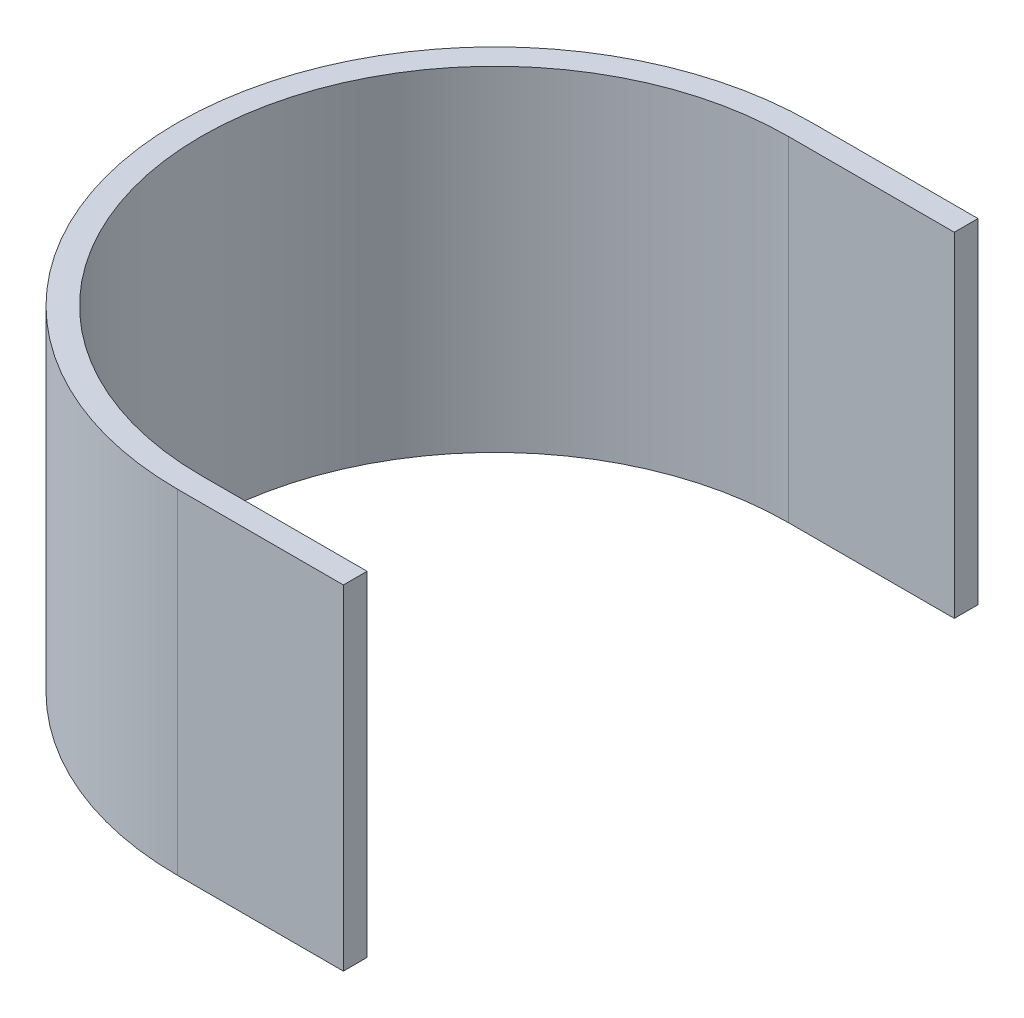
ISO-10303-21;
HEADER;
FILE_DESCRIPTION(('STEP AP214'),'2;1');
FILE_NAME('part.step','',(''),(''),'','','');
FILE_SCHEMA(('AUTOMOTIVE_DESIGN { 1 0 10303 214 1 1 1 1 }'));
ENDSEC;
DATA;
#1=APPLICATION_CONTEXT('core data for automotive mechanical design processes');
#2=APPLICATION_PROTOCOL_DEFINITION('international standard','automotive_design',2000,#1);
#3=PRODUCT_CONTEXT('',#1,'mechanical');
#4=PRODUCT('Part','Part','',(#3));
#5=PRODUCT_RELATED_PRODUCT_CATEGORY('part','',(#4));
#6=PRODUCT_DEFINITION_FORMATION('','',#4);
#7=PRODUCT_DEFINITION_CONTEXT('part definition',#1,'design');
#8=PRODUCT_DEFINITION('design','',#6,#7);
#9=PRODUCT_DEFINITION_SHAPE('','',#8);
#10=(LENGTH_UNIT() NAMED_UNIT(*) SI_UNIT(.MILLI.,.METRE.));
#11=(NAMED_UNIT(*) PLANE_ANGLE_UNIT() SI_UNIT($,.RADIAN.));
#12=(NAMED_UNIT(*) SI_UNIT($,.STERADIAN.) SOLID_ANGLE_UNIT());
#13=UNCERTAINTY_MEASURE_WITH_UNIT(LENGTH_MEASURE(1.E-05),#10,'distance_accuracy_value','');
#14=(GEOMETRIC_REPRESENTATION_CONTEXT(3) GLOBAL_UNCERTAINTY_ASSIGNED_CONTEXT((#13)) GLOBAL_UNIT_ASSIGNED_CONTEXT((#10,
#11,#12)) REPRESENTATION_CONTEXT('',''));
#15=CARTESIAN_POINT('',(0.,0.,0.));
#16=DIRECTION('',(0.,0.,1.));
#17=DIRECTION('',(1.,0.,0.));
#18=AXIS2_PLACEMENT_3D('',#15,#16,#17);
#19=CARTESIAN_POINT('',(24.7557848849845,25.4,-18.975187751943));
#20=DIRECTION('',(0.,-1.,0.));
#21=DIRECTION('',(0.,0.,-1.));
#22=AXIS2_PLACEMENT_3D('',#19,#20,#21);
#23=CYLINDRICAL_SURFACE('',#22,22.2977330049148);
#24=CARTESIAN_POINT('',(24.7557848849845,0.,-18.975187751943));
#25=DIRECTION('',(0.,-1.,0.));
#26=DIRECTION('',(0.,0.,1.));
#27=AXIS2_PLACEMENT_3D('',#24,#25,#26);
#28=CIRCLE('',#27,22.2977330049148);
#29=CARTESIAN_POINT('',(24.7557848849845,0.,3.32254525297184));
#30=VERTEX_POINT('',#29);
#31=CARTESIAN_POINT('',(24.7557848849845,0.,-41.2729207568578));
#32=VERTEX_POINT('',#31);
#33=EDGE_CURVE('E133',#30,#32,#28,.T.);
#34=ORIENTED_EDGE('',*,*,#33,.T.);
#35=DIRECTION('',(0.,-1.,0.));
#36=VECTOR('',#35,1.);
#37=CARTESIAN_POINT('',(24.7557848849845,25.4,-41.2729207568578));
#38=LINE('',#37,#36);
#39=CARTESIAN_POINT('',(24.7557848849845,25.4,-41.2729207568578));
#40=VERTEX_POINT('',#39);
#41=EDGE_CURVE('E11',#40,#32,#38,.T.);
#42=ORIENTED_EDGE('',*,*,#41,.F.);
#43=CARTESIAN_POINT('',(24.7557848849845,25.4,-18.975187751943));
#44=DIRECTION('',(0.,-1.,0.));
#45=DIRECTION('',(0.,0.,1.));
#46=AXIS2_PLACEMENT_3D('',#43,#44,#45);
#47=CIRCLE('',#46,22.2977330049148);
#48=CARTESIAN_POINT('',(24.7557848849845,25.4,3.32254525297184));
#49=VERTEX_POINT('',#48);
#50=EDGE_CURVE('E147',#49,#40,#47,.T.);
#51=ORIENTED_EDGE('',*,*,#50,.F.);
#52=DIRECTION('',(0.,-1.,0.));
#53=VECTOR('',#52,1.);
#54=CARTESIAN_POINT('',(24.7557848849845,25.4,3.32254525297184));
#55=LINE('',#54,#53);
#56=EDGE_CURVE('E129',#49,#30,#55,.T.);
#57=ORIENTED_EDGE('',*,*,#56,.T.);
#58=EDGE_LOOP('',(#34,#42,#51,#57));
#59=FACE_BOUND('',#58,.T.);
#60=ADVANCED_FACE('F37',(#59),#23,.F.);
#61=CARTESIAN_POINT('',(37.3569728849845,25.4,-41.2729207568578));
#62=DIRECTION('',(0.,0.,-1.));
#63=DIRECTION('',(-1.,0.,0.));
#64=AXIS2_PLACEMENT_3D('',#61,#62,#63);
#65=PLANE('',#64);
#66=DIRECTION('',(1.,0.,0.));
#67=VECTOR('',#66,1.);
#68=CARTESIAN_POINT('',(37.3569728849845,0.,-41.2729207568578));
#69=LINE('',#68,#67);
#70=CARTESIAN_POINT('',(37.3569728849845,0.,-41.2729207568578));
#71=VERTEX_POINT('',#70);
#72=EDGE_CURVE('E136',#32,#71,#69,.T.);
#73=ORIENTED_EDGE('',*,*,#72,.T.);
#74=DIRECTION('',(0.,-1.,0.));
#75=VECTOR('',#74,1.);
#76=CARTESIAN_POINT('',(37.3569728849845,25.4,-41.2729207568578));
#77=LINE('',#76,#75);
#78=CARTESIAN_POINT('',(37.3569728849845,25.4,-41.2729207568578));
#79=VERTEX_POINT('',#78);
#80=EDGE_CURVE('E45',#79,#71,#77,.T.);
#81=ORIENTED_EDGE('',*,*,#80,.F.);
#82=DIRECTION('',(1.,0.,0.));
#83=VECTOR('',#82,1.);
#84=CARTESIAN_POINT('',(37.3569728849845,25.4,-41.2729207568578));
#85=LINE('',#84,#83);
#86=EDGE_CURVE('E96',#40,#79,#85,.T.);
#87=ORIENTED_EDGE('',*,*,#86,.F.);
#88=ORIENTED_EDGE('',*,*,#41,.T.);
#89=EDGE_LOOP('',(#73,#81,#87,#88));
#90=FACE_BOUND('',#89,.T.);
#91=ADVANCED_FACE('F182',(#90),#65,.F.);
#92=CARTESIAN_POINT('',(37.3569728849845,25.4,-43.0729207568578));
#93=DIRECTION('',(-1.,0.,0.));
#94=DIRECTION('',(0.,0.,1.));
#95=AXIS2_PLACEMENT_3D('',#92,#93,#94);
#96=PLANE('',#95);
#97=DIRECTION('',(0.,0.,-1.));
#98=VECTOR('',#97,1.);
#99=CARTESIAN_POINT('',(37.3569728849845,0.,-43.0729207568578));
#100=LINE('',#99,#98);
#101=CARTESIAN_POINT('',(37.3569728849845,0.,-43.0729207568578));
#102=VERTEX_POINT('',#101);
#103=EDGE_CURVE('E138',#71,#102,#100,.T.);
#104=ORIENTED_EDGE('',*,*,#103,.T.);
#105=DIRECTION('',(0.,-1.,0.));
#106=VECTOR('',#105,1.);
#107=CARTESIAN_POINT('',(37.3569728849845,25.4,-43.0729207568578));
#108=LINE('',#107,#106);
#109=CARTESIAN_POINT('',(37.3569728849845,25.4,-43.0729207568578));
#110=VERTEX_POINT('',#109);
#111=EDGE_CURVE('E154',#110,#102,#108,.T.);
#112=ORIENTED_EDGE('',*,*,#111,.F.);
#113=DIRECTION('',(0.,0.,-1.));
#114=VECTOR('',#113,1.);
#115=CARTESIAN_POINT('',(37.3569728849845,25.4,-43.0729207568578));
#116=LINE('',#115,#114);
#117=EDGE_CURVE('E162',#79,#110,#116,.T.);
#118=ORIENTED_EDGE('',*,*,#117,.F.);
#119=ORIENTED_EDGE('',*,*,#80,.T.);
#120=EDGE_LOOP('',(#104,#112,#118,#119));
#121=FACE_BOUND('',#120,.T.);
#122=ADVANCED_FACE('F160',(#121),#96,.F.);
#123=CARTESIAN_POINT('',(37.3569728849845,25.4,-43.0729207568578));
#124=DIRECTION('',(0.,0.,1.));
#125=DIRECTION('',(1.,0.,0.));
#126=AXIS2_PLACEMENT_3D('',#123,#124,#125);
#127=PLANE('',#126);
#128=DIRECTION('',(-1.,0.,0.));
#129=VECTOR('',#128,1.);
#130=CARTESIAN_POINT('',(37.3569728849845,0.,-43.0729207568578));
#131=LINE('',#130,#129);
#132=CARTESIAN_POINT('',(24.7557848849845,0.,-43.0729207568578));
#133=VERTEX_POINT('',#132);
#134=EDGE_CURVE('E140',#102,#133,#131,.T.);
#135=ORIENTED_EDGE('',*,*,#134,.T.);
#136=DIRECTION('',(0.,-1.,0.));
#137=VECTOR('',#136,1.);
#138=CARTESIAN_POINT('',(24.7557848849845,25.4,-43.0729207568578));
#139=LINE('',#138,#137);
#140=CARTESIAN_POINT('',(24.7557848849845,25.4,-43.0729207568578));
#141=VERTEX_POINT('',#140);
#142=EDGE_CURVE('E151',#141,#133,#139,.T.);
#143=ORIENTED_EDGE('',*,*,#142,.F.);
#144=DIRECTION('',(-1.,0.,0.));
#145=VECTOR('',#144,1.);
#146=CARTESIAN_POINT('',(37.3569728849845,25.4,-43.0729207568578));
#147=LINE('',#146,#145);
#148=EDGE_CURVE('E174',#110,#141,#147,.T.);
#149=ORIENTED_EDGE('',*,*,#148,.F.);
#150=ORIENTED_EDGE('',*,*,#111,.T.);
#151=EDGE_LOOP('',(#135,#143,#149,#150));
#152=FACE_BOUND('',#151,.T.);
#153=ADVANCED_FACE('F170',(#152),#127,.F.);
#154=CARTESIAN_POINT('',(24.7557848849845,25.4,-18.975187751943));
#155=DIRECTION('',(0.,-1.,0.));
#156=DIRECTION('',(0.,0.,-1.));
#157=AXIS2_PLACEMENT_3D('',#154,#155,#156);
#158=CYLINDRICAL_SURFACE('',#157,24.0977330049148);
#159=CARTESIAN_POINT('',(24.7557848849845,0.,-18.975187751943));
#160=DIRECTION('',(0.,1.,0.));
#161=DIRECTION('',(0.,0.,1.));
#162=AXIS2_PLACEMENT_3D('',#159,#160,#161);
#163=CIRCLE('',#162,24.0977330049148);
#164=CARTESIAN_POINT('',(24.7557848849845,0.,5.12254525297185));
#165=VERTEX_POINT('',#164);
#166=EDGE_CURVE('E142',#133,#165,#163,.T.);
#167=ORIENTED_EDGE('',*,*,#166,.T.);
#168=DIRECTION('',(0.,-1.,0.));
#169=VECTOR('',#168,1.);
#170=CARTESIAN_POINT('',(24.7557848849845,25.4,5.12254525297185));
#171=LINE('',#170,#169);
#172=CARTESIAN_POINT('',(24.7557848849845,25.4,5.12254525297185));
#173=VERTEX_POINT('',#172);
#174=EDGE_CURVE('E124',#173,#165,#171,.T.);
#175=ORIENTED_EDGE('',*,*,#174,.F.);
#176=CARTESIAN_POINT('',(24.7557848849845,25.4,-18.975187751943));
#177=DIRECTION('',(0.,1.,0.));
#178=DIRECTION('',(0.,0.,1.));
#179=AXIS2_PLACEMENT_3D('',#176,#177,#178);
#180=CIRCLE('',#179,24.0977330049148);
#181=EDGE_CURVE('E115',#141,#173,#180,.T.);
#182=ORIENTED_EDGE('',*,*,#181,.F.);
#183=ORIENTED_EDGE('',*,*,#142,.T.);
#184=EDGE_LOOP('',(#167,#175,#182,#183));
#185=FACE_BOUND('',#184,.T.);
#186=ADVANCED_FACE('F173',(#185),#158,.T.);
#187=CARTESIAN_POINT('',(24.7557848849845,25.4,5.12254525297185));
#188=DIRECTION('',(0.,0.,-1.));
#189=DIRECTION('',(-1.,0.,0.));
#190=AXIS2_PLACEMENT_3D('',#187,#188,#189);
#191=PLANE('',#190);
#192=DIRECTION('',(1.,0.,0.));
#193=VECTOR('',#192,1.);
#194=CARTESIAN_POINT('',(24.7557848849845,0.,5.12254525297185));
#195=LINE('',#194,#193);
#196=CARTESIAN_POINT('',(37.3569728849845,0.,5.12254525297184));
#197=VERTEX_POINT('',#196);
#198=EDGE_CURVE('E123',#165,#197,#195,.T.);
#199=ORIENTED_EDGE('',*,*,#198,.T.);
#200=DIRECTION('',(0.,-1.,0.));
#201=VECTOR('',#200,1.);
#202=CARTESIAN_POINT('',(37.3569728849845,25.4,5.12254525297184));
#203=LINE('',#202,#201);
#204=CARTESIAN_POINT('',(37.3569728849845,25.4,5.12254525297184));
#205=VERTEX_POINT('',#204);
#206=EDGE_CURVE('E120',#205,#197,#203,.T.);
#207=ORIENTED_EDGE('',*,*,#206,.F.);
#208=DIRECTION('',(1.,0.,0.));
#209=VECTOR('',#208,1.);
#210=CARTESIAN_POINT('',(24.7557848849845,25.4,5.12254525297185));
#211=LINE('',#210,#209);
#212=EDGE_CURVE('E109',#173,#205,#211,.T.);
#213=ORIENTED_EDGE('',*,*,#212,.F.);
#214=ORIENTED_EDGE('',*,*,#174,.T.);
#215=EDGE_LOOP('',(#199,#207,#213,#214));
#216=FACE_BOUND('',#215,.T.);
#217=ADVANCED_FACE('F121',(#216),#191,.F.);
#218=CARTESIAN_POINT('',(37.3569728849845,25.4,3.32254525297184));
#219=DIRECTION('',(-1.,0.,0.));
#220=DIRECTION('',(0.,0.,1.));
#221=AXIS2_PLACEMENT_3D('',#218,#219,#220);
#222=PLANE('',#221);
#223=DIRECTION('',(0.,0.,-1.));
#224=VECTOR('',#223,1.);
#225=CARTESIAN_POINT('',(37.3569728849845,0.,3.32254525297184));
#226=LINE('',#225,#224);
#227=CARTESIAN_POINT('',(37.3569728849845,0.,3.32254525297184));
#228=VERTEX_POINT('',#227);
#229=EDGE_CURVE('E82',#197,#228,#226,.T.);
#230=ORIENTED_EDGE('',*,*,#229,.T.);
#231=DIRECTION('',(0.,-1.,0.));
#232=VECTOR('',#231,1.);
#233=CARTESIAN_POINT('',(37.3569728849845,25.4,3.32254525297184));
#234=LINE('',#233,#232);
#235=CARTESIAN_POINT('',(37.3569728849845,25.4,3.32254525297184));
#236=VERTEX_POINT('',#235);
#237=EDGE_CURVE('E125',#236,#228,#234,.T.);
#238=ORIENTED_EDGE('',*,*,#237,.F.);
#239=DIRECTION('',(0.,0.,-1.));
#240=VECTOR('',#239,1.);
#241=CARTESIAN_POINT('',(37.3569728849845,25.4,3.32254525297184));
#242=LINE('',#241,#240);
#243=EDGE_CURVE('E113',#205,#236,#242,.T.);
#244=ORIENTED_EDGE('',*,*,#243,.F.);
#245=ORIENTED_EDGE('',*,*,#206,.T.);
#246=EDGE_LOOP('',(#230,#238,#244,#245));
#247=FACE_BOUND('',#246,.T.);
#248=ADVANCED_FACE('F127',(#247),#222,.F.);
#249=CARTESIAN_POINT('',(24.7557848849845,25.4,3.32254525297184));
#250=DIRECTION('',(0.,0.,1.));
#251=DIRECTION('',(1.,0.,0.));
#252=AXIS2_PLACEMENT_3D('',#249,#250,#251);
#253=PLANE('',#252);
#254=DIRECTION('',(-1.,0.,0.));
#255=VECTOR('',#254,1.);
#256=CARTESIAN_POINT('',(24.7557848849845,0.,3.32254525297184));
#257=LINE('',#256,#255);
#258=EDGE_CURVE('E88',#228,#30,#257,.T.);
#259=ORIENTED_EDGE('',*,*,#258,.T.);
#260=ORIENTED_EDGE('',*,*,#56,.F.);
#261=DIRECTION('',(-1.,0.,0.));
#262=VECTOR('',#261,1.);
#263=CARTESIAN_POINT('',(24.7557848849845,25.4,3.32254525297184));
#264=LINE('',#263,#262);
#265=EDGE_CURVE('E53',#236,#49,#264,.T.);
#266=ORIENTED_EDGE('',*,*,#265,.F.);
#267=ORIENTED_EDGE('',*,*,#237,.T.);
#268=EDGE_LOOP('',(#259,#260,#266,#267));
#269=FACE_BOUND('',#268,.T.);
#270=ADVANCED_FACE('F198',(#269),#253,.F.);
#271=CARTESIAN_POINT('',(24.7557848849845,25.4,-18.975187751943));
#272=DIRECTION('',(0.,1.,0.));
#273=DIRECTION('',(0.,0.,1.));
#274=AXIS2_PLACEMENT_3D('',#271,#272,#273);
#275=PLANE('',#274);
#276=ORIENTED_EDGE('',*,*,#50,.T.);
#277=ORIENTED_EDGE('',*,*,#86,.T.);
#278=ORIENTED_EDGE('',*,*,#117,.T.);
#279=ORIENTED_EDGE('',*,*,#148,.T.);
#280=ORIENTED_EDGE('',*,*,#181,.T.);
#281=ORIENTED_EDGE('',*,*,#212,.T.);
#282=ORIENTED_EDGE('',*,*,#243,.T.);
#283=ORIENTED_EDGE('',*,*,#265,.T.);
#284=EDGE_LOOP('',(#276,#277,#278,#279,#280,#281,#282,#283));
#285=FACE_BOUND('',#284,.T.);
#286=ADVANCED_FACE('F111',(#285),#275,.T.);
#287=CARTESIAN_POINT('',(24.7557848849845,0.,-18.975187751943));
#288=DIRECTION('',(0.,1.,0.));
#289=DIRECTION('',(0.,0.,1.));
#290=AXIS2_PLACEMENT_3D('',#287,#288,#289);
#291=PLANE('',#290);
#292=ORIENTED_EDGE('',*,*,#33,.F.);
#293=ORIENTED_EDGE('',*,*,#258,.F.);
#294=ORIENTED_EDGE('',*,*,#229,.F.);
#295=ORIENTED_EDGE('',*,*,#198,.F.);
#296=ORIENTED_EDGE('',*,*,#166,.F.);
#297=ORIENTED_EDGE('',*,*,#134,.F.);
#298=ORIENTED_EDGE('',*,*,#103,.F.);
#299=ORIENTED_EDGE('',*,*,#72,.F.);
#300=EDGE_LOOP('',(#292,#293,#294,#295,#296,#297,#298,#299));
#301=FACE_BOUND('',#300,.T.);
#302=ADVANCED_FACE('F166',(#301),#291,.F.);
#303=CLOSED_SHELL('',(#60,#91,#122,#153,#186,#217,#248,#270,#286,#302));
#304=MANIFOLD_SOLID_BREP('B2',#303);
#305=ADVANCED_BREP_SHAPE_REPRESENTATION('',(#18,#304),#14);
#306=SHAPE_DEFINITION_REPRESENTATION(#9,#305);
ENDSEC;
END-ISO-10303-21;
